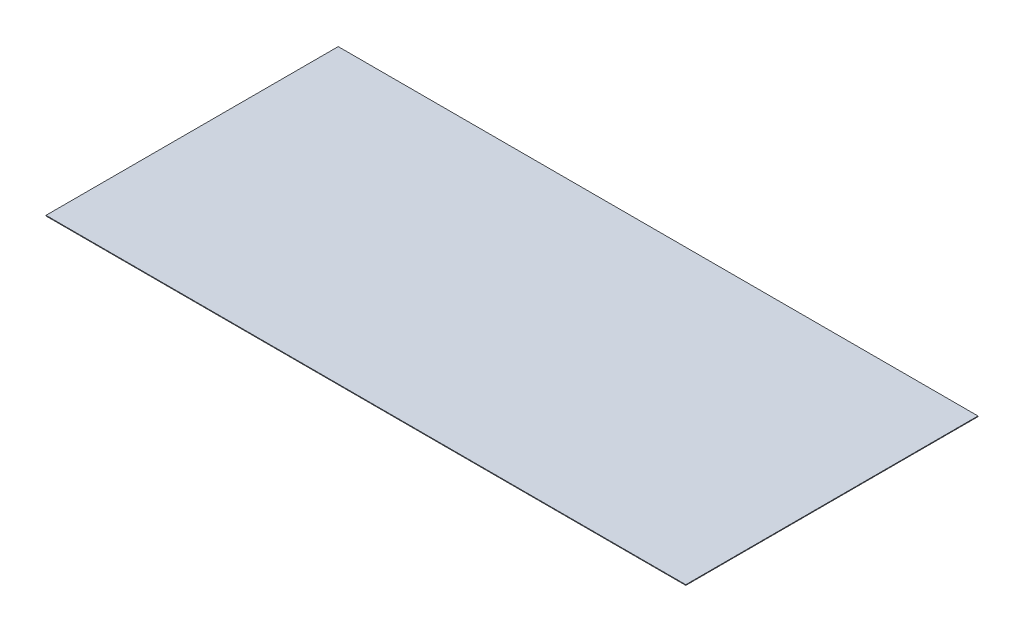
ISO-10303-21;
HEADER;
FILE_DESCRIPTION(('STEP AP214'),'2;1');
FILE_NAME('part.step','',(''),(''),'','','');
FILE_SCHEMA(('AUTOMOTIVE_DESIGN { 1 0 10303 214 1 1 1 1 }'));
ENDSEC;
DATA;
#1=APPLICATION_CONTEXT('core data for automotive mechanical design processes');
#2=APPLICATION_PROTOCOL_DEFINITION('international standard','automotive_design',2000,#1);
#3=PRODUCT_CONTEXT('',#1,'mechanical');
#4=PRODUCT('Part','Part','',(#3));
#5=PRODUCT_RELATED_PRODUCT_CATEGORY('part','',(#4));
#6=PRODUCT_DEFINITION_FORMATION('','',#4);
#7=PRODUCT_DEFINITION_CONTEXT('part definition',#1,'design');
#8=PRODUCT_DEFINITION('design','',#6,#7);
#9=PRODUCT_DEFINITION_SHAPE('','',#8);
#10=(LENGTH_UNIT() NAMED_UNIT(*) SI_UNIT(.MILLI.,.METRE.));
#11=(NAMED_UNIT(*) PLANE_ANGLE_UNIT() SI_UNIT($,.RADIAN.));
#12=(NAMED_UNIT(*) SI_UNIT($,.STERADIAN.) SOLID_ANGLE_UNIT());
#13=UNCERTAINTY_MEASURE_WITH_UNIT(LENGTH_MEASURE(1.E-05),#10,'distance_accuracy_value','');
#14=(GEOMETRIC_REPRESENTATION_CONTEXT(3) GLOBAL_UNCERTAINTY_ASSIGNED_CONTEXT((#13)) GLOBAL_UNIT_ASSIGNED_CONTEXT((#10,
#11,#12)) REPRESENTATION_CONTEXT('',''));
#15=CARTESIAN_POINT('',(0.,0.,0.));
#16=DIRECTION('',(0.,0.,1.));
#17=DIRECTION('',(1.,0.,0.));
#18=AXIS2_PLACEMENT_3D('',#15,#16,#17);
#19=CARTESIAN_POINT('',(0.,1.,-227.));
#20=DIRECTION('',(1.,0.,0.));
#21=DIRECTION('',(0.,0.,-1.));
#22=AXIS2_PLACEMENT_3D('',#19,#20,#21);
#23=PLANE('',#22);
#24=DIRECTION('',(0.,0.,1.));
#25=VECTOR('',#24,1.);
#26=CARTESIAN_POINT('',(0.,0.,-227.));
#27=LINE('',#26,#25);
#28=CARTESIAN_POINT('',(0.,0.,-227.));
#29=VERTEX_POINT('',#28);
#30=CARTESIAN_POINT('',(0.,0.,227.));
#31=VERTEX_POINT('',#30);
#32=EDGE_CURVE('E97',#29,#31,#27,.T.);
#33=ORIENTED_EDGE('',*,*,#32,.T.);
#34=DIRECTION('',(0.,-1.,0.));
#35=VECTOR('',#34,1.);
#36=CARTESIAN_POINT('',(0.,1.,227.));
#37=LINE('',#36,#35);
#38=CARTESIAN_POINT('',(0.,1.,227.));
#39=VERTEX_POINT('',#38);
#40=EDGE_CURVE('E11',#39,#31,#37,.T.);
#41=ORIENTED_EDGE('',*,*,#40,.F.);
#42=DIRECTION('',(0.,0.,1.));
#43=VECTOR('',#42,1.);
#44=CARTESIAN_POINT('',(0.,1.,-227.));
#45=LINE('',#44,#43);
#46=CARTESIAN_POINT('',(0.,1.,-227.));
#47=VERTEX_POINT('',#46);
#48=EDGE_CURVE('E85',#47,#39,#45,.T.);
#49=ORIENTED_EDGE('',*,*,#48,.F.);
#50=DIRECTION('',(0.,-1.,0.));
#51=VECTOR('',#50,1.);
#52=CARTESIAN_POINT('',(0.,1.,-227.));
#53=LINE('',#52,#51);
#54=EDGE_CURVE('E93',#47,#29,#53,.T.);
#55=ORIENTED_EDGE('',*,*,#54,.T.);
#56=EDGE_LOOP('',(#33,#41,#49,#55));
#57=FACE_BOUND('',#56,.T.);
#58=ADVANCED_FACE('F34',(#57),#23,.F.);
#59=CARTESIAN_POINT('',(0.,1.,227.));
#60=DIRECTION('',(0.,0.,-1.));
#61=DIRECTION('',(-1.,0.,0.));
#62=AXIS2_PLACEMENT_3D('',#59,#60,#61);
#63=PLANE('',#62);
#64=DIRECTION('',(1.,0.,0.));
#65=VECTOR('',#64,1.);
#66=CARTESIAN_POINT('',(0.,0.,227.));
#67=LINE('',#66,#65);
#68=CARTESIAN_POINT('',(994.,0.,227.));
#69=VERTEX_POINT('',#68);
#70=EDGE_CURVE('E89',#31,#69,#67,.T.);
#71=ORIENTED_EDGE('',*,*,#70,.T.);
#72=DIRECTION('',(0.,-1.,0.));
#73=VECTOR('',#72,1.);
#74=CARTESIAN_POINT('',(994.,1.,227.));
#75=LINE('',#74,#73);
#76=CARTESIAN_POINT('',(994.,1.,227.));
#77=VERTEX_POINT('',#76);
#78=EDGE_CURVE('E42',#77,#69,#75,.T.);
#79=ORIENTED_EDGE('',*,*,#78,.F.);
#80=DIRECTION('',(1.,0.,0.));
#81=VECTOR('',#80,1.);
#82=CARTESIAN_POINT('',(0.,1.,227.));
#83=LINE('',#82,#81);
#84=EDGE_CURVE('E80',#39,#77,#83,.T.);
#85=ORIENTED_EDGE('',*,*,#84,.F.);
#86=ORIENTED_EDGE('',*,*,#40,.T.);
#87=EDGE_LOOP('',(#71,#79,#85,#86));
#88=FACE_BOUND('',#87,.T.);
#89=ADVANCED_FACE('F88',(#88),#63,.F.);
#90=CARTESIAN_POINT('',(994.,1.,-227.));
#91=DIRECTION('',(-1.,0.,0.));
#92=DIRECTION('',(0.,0.,1.));
#93=AXIS2_PLACEMENT_3D('',#90,#91,#92);
#94=PLANE('',#93);
#95=DIRECTION('',(0.,0.,-1.));
#96=VECTOR('',#95,1.);
#97=CARTESIAN_POINT('',(994.,0.,-227.));
#98=LINE('',#97,#96);
#99=CARTESIAN_POINT('',(994.,0.,-227.));
#100=VERTEX_POINT('',#99);
#101=EDGE_CURVE('E67',#69,#100,#98,.T.);
#102=ORIENTED_EDGE('',*,*,#101,.T.);
#103=DIRECTION('',(0.,-1.,0.));
#104=VECTOR('',#103,1.);
#105=CARTESIAN_POINT('',(994.,1.,-227.));
#106=LINE('',#105,#104);
#107=CARTESIAN_POINT('',(994.,1.,-227.));
#108=VERTEX_POINT('',#107);
#109=EDGE_CURVE('E90',#108,#100,#106,.T.);
#110=ORIENTED_EDGE('',*,*,#109,.F.);
#111=DIRECTION('',(0.,0.,-1.));
#112=VECTOR('',#111,1.);
#113=CARTESIAN_POINT('',(994.,1.,-227.));
#114=LINE('',#113,#112);
#115=EDGE_CURVE('E83',#77,#108,#114,.T.);
#116=ORIENTED_EDGE('',*,*,#115,.F.);
#117=ORIENTED_EDGE('',*,*,#78,.T.);
#118=EDGE_LOOP('',(#102,#110,#116,#117));
#119=FACE_BOUND('',#118,.T.);
#120=ADVANCED_FACE('F91',(#119),#94,.F.);
#121=CARTESIAN_POINT('',(0.,1.,-227.));
#122=DIRECTION('',(0.,0.,1.));
#123=DIRECTION('',(1.,0.,0.));
#124=AXIS2_PLACEMENT_3D('',#121,#122,#123);
#125=PLANE('',#124);
#126=DIRECTION('',(-1.,0.,0.));
#127=VECTOR('',#126,1.);
#128=CARTESIAN_POINT('',(0.,0.,-227.));
#129=LINE('',#128,#127);
#130=EDGE_CURVE('E73',#100,#29,#129,.T.);
#131=ORIENTED_EDGE('',*,*,#130,.T.);
#132=ORIENTED_EDGE('',*,*,#54,.F.);
#133=DIRECTION('',(-1.,0.,0.));
#134=VECTOR('',#133,1.);
#135=CARTESIAN_POINT('',(0.,1.,-227.));
#136=LINE('',#135,#134);
#137=EDGE_CURVE('E50',#108,#47,#136,.T.);
#138=ORIENTED_EDGE('',*,*,#137,.F.);
#139=ORIENTED_EDGE('',*,*,#109,.T.);
#140=EDGE_LOOP('',(#131,#132,#138,#139));
#141=FACE_BOUND('',#140,.T.);
#142=ADVANCED_FACE('F104',(#141),#125,.F.);
#143=CARTESIAN_POINT('',(0.,1.,227.));
#144=DIRECTION('',(0.,1.,0.));
#145=DIRECTION('',(0.,0.,1.));
#146=AXIS2_PLACEMENT_3D('',#143,#144,#145);
#147=PLANE('',#146);
#148=ORIENTED_EDGE('',*,*,#48,.T.);
#149=ORIENTED_EDGE('',*,*,#84,.T.);
#150=ORIENTED_EDGE('',*,*,#115,.T.);
#151=ORIENTED_EDGE('',*,*,#137,.T.);
#152=EDGE_LOOP('',(#148,#149,#150,#151));
#153=FACE_BOUND('',#152,.T.);
#154=ADVANCED_FACE('F81',(#153),#147,.T.);
#155=CARTESIAN_POINT('',(0.,0.,227.));
#156=DIRECTION('',(0.,1.,0.));
#157=DIRECTION('',(0.,0.,1.));
#158=AXIS2_PLACEMENT_3D('',#155,#156,#157);
#159=PLANE('',#158);
#160=ORIENTED_EDGE('',*,*,#32,.F.);
#161=ORIENTED_EDGE('',*,*,#130,.F.);
#162=ORIENTED_EDGE('',*,*,#101,.F.);
#163=ORIENTED_EDGE('',*,*,#70,.F.);
#164=EDGE_LOOP('',(#160,#161,#162,#163));
#165=FACE_BOUND('',#164,.T.);
#166=ADVANCED_FACE('F107',(#165),#159,.F.);
#167=CLOSED_SHELL('',(#58,#89,#120,#142,#154,#166));
#168=MANIFOLD_SOLID_BREP('B2',#167);
#169=ADVANCED_BREP_SHAPE_REPRESENTATION('',(#18,#168),#14);
#170=SHAPE_DEFINITION_REPRESENTATION(#9,#169);
ENDSEC;
END-ISO-10303-21;
